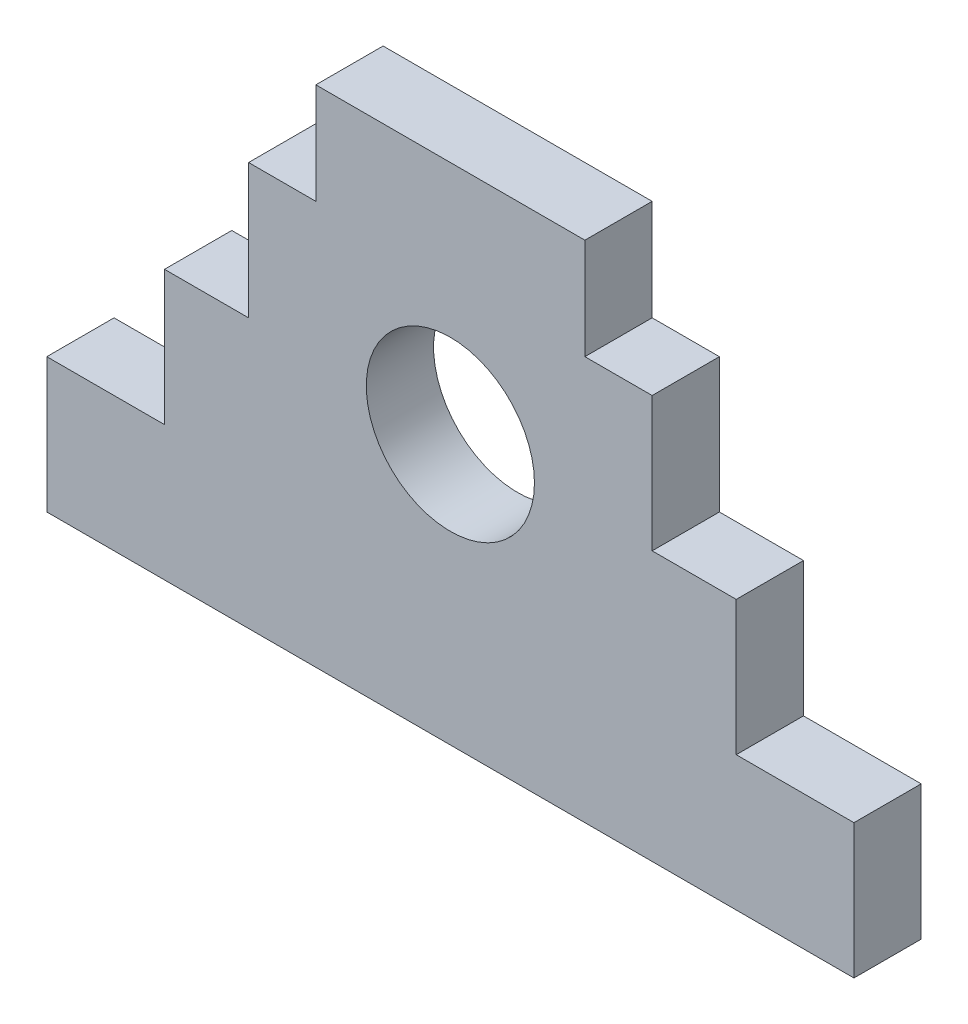
ISO-10303-21;
HEADER;
FILE_DESCRIPTION(('STEP AP214'),'2;1');
FILE_NAME('part.step','',(''),(''),'','','');
FILE_SCHEMA(('AUTOMOTIVE_DESIGN { 1 0 10303 214 1 1 1 1 }'));
ENDSEC;
DATA;
#1=APPLICATION_CONTEXT('core data for automotive mechanical design processes');
#2=APPLICATION_PROTOCOL_DEFINITION('international standard','automotive_design',2000,#1);
#3=PRODUCT_CONTEXT('',#1,'mechanical');
#4=PRODUCT('Part','Part','',(#3));
#5=PRODUCT_RELATED_PRODUCT_CATEGORY('part','',(#4));
#6=PRODUCT_DEFINITION_FORMATION('','',#4);
#7=PRODUCT_DEFINITION_CONTEXT('part definition',#1,'design');
#8=PRODUCT_DEFINITION('design','',#6,#7);
#9=PRODUCT_DEFINITION_SHAPE('','',#8);
#10=(LENGTH_UNIT() NAMED_UNIT(*) SI_UNIT(.MILLI.,.METRE.));
#11=(NAMED_UNIT(*) PLANE_ANGLE_UNIT() SI_UNIT($,.RADIAN.));
#12=(NAMED_UNIT(*) SI_UNIT($,.STERADIAN.) SOLID_ANGLE_UNIT());
#13=UNCERTAINTY_MEASURE_WITH_UNIT(LENGTH_MEASURE(1.E-05),#10,'distance_accuracy_value','');
#14=(GEOMETRIC_REPRESENTATION_CONTEXT(3) GLOBAL_UNCERTAINTY_ASSIGNED_CONTEXT((#13)) GLOBAL_UNIT_ASSIGNED_CONTEXT((#10,
#11,#12)) REPRESENTATION_CONTEXT('',''));
#15=CARTESIAN_POINT('',(0.,0.,0.));
#16=DIRECTION('',(0.,0.,1.));
#17=DIRECTION('',(1.,0.,0.));
#18=AXIS2_PLACEMENT_3D('',#15,#16,#17);
#19=CARTESIAN_POINT('',(0.,-12.7,6.35));
#20=DIRECTION('',(0.,0.,1.));
#21=DIRECTION('',(1.,0.,0.));
#22=AXIS2_PLACEMENT_3D('',#19,#20,#21);
#23=PLANE('',#22);
#24=DIRECTION('',(0.,-1.,0.));
#25=VECTOR('',#24,1.);
#26=CARTESIAN_POINT('',(0.,0.,6.35));
#27=LINE('',#26,#25);
#28=CARTESIAN_POINT('',(0.,0.,6.35));
#29=VERTEX_POINT('',#28);
#30=CARTESIAN_POINT('',(0.,-12.7,6.35));
#31=VERTEX_POINT('',#30);
#32=EDGE_CURVE('E204',#29,#31,#27,.T.);
#33=ORIENTED_EDGE('',*,*,#32,.T.);
#34=DIRECTION('',(1.,0.,0.));
#35=VECTOR('',#34,1.);
#36=CARTESIAN_POINT('',(0.,-12.7,6.35));
#37=LINE('',#36,#35);
#38=CARTESIAN_POINT('',(76.2,-12.7,6.35));
#39=VERTEX_POINT('',#38);
#40=EDGE_CURVE('E112',#31,#39,#37,.T.);
#41=ORIENTED_EDGE('',*,*,#40,.T.);
#42=DIRECTION('',(0.,1.,0.));
#43=VECTOR('',#42,1.);
#44=CARTESIAN_POINT('',(76.2,-12.7,6.35));
#45=LINE('',#44,#43);
#46=CARTESIAN_POINT('',(76.2,0.,6.35));
#47=VERTEX_POINT('',#46);
#48=EDGE_CURVE('E243',#39,#47,#45,.T.);
#49=ORIENTED_EDGE('',*,*,#48,.T.);
#50=DIRECTION('',(-1.,0.,0.));
#51=VECTOR('',#50,1.);
#52=CARTESIAN_POINT('',(76.2,0.,6.35));
#53=LINE('',#52,#51);
#54=CARTESIAN_POINT('',(65.0875,0.,6.35));
#55=VERTEX_POINT('',#54);
#56=EDGE_CURVE('E262',#47,#55,#53,.T.);
#57=ORIENTED_EDGE('',*,*,#56,.T.);
#58=DIRECTION('',(0.,1.,0.));
#59=VECTOR('',#58,1.);
#60=CARTESIAN_POINT('',(65.0875,0.,6.35));
#61=LINE('',#60,#59);
#62=CARTESIAN_POINT('',(65.0875,12.7,6.35));
#63=VERTEX_POINT('',#62);
#64=EDGE_CURVE('E259',#55,#63,#61,.T.);
#65=ORIENTED_EDGE('',*,*,#64,.T.);
#66=DIRECTION('',(-1.,0.,0.));
#67=VECTOR('',#66,1.);
#68=CARTESIAN_POINT('',(65.0875,12.7,6.35));
#69=LINE('',#68,#67);
#70=CARTESIAN_POINT('',(57.15,12.7,6.35));
#71=VERTEX_POINT('',#70);
#72=EDGE_CURVE('E261',#63,#71,#69,.T.);
#73=ORIENTED_EDGE('',*,*,#72,.T.);
#74=DIRECTION('',(0.,1.,0.));
#75=VECTOR('',#74,1.);
#76=CARTESIAN_POINT('',(57.15,12.7,6.35));
#77=LINE('',#76,#75);
#78=CARTESIAN_POINT('',(57.15,25.4,6.35));
#79=VERTEX_POINT('',#78);
#80=EDGE_CURVE('E264',#71,#79,#77,.T.);
#81=ORIENTED_EDGE('',*,*,#80,.T.);
#82=DIRECTION('',(-1.,0.,0.));
#83=VECTOR('',#82,1.);
#84=CARTESIAN_POINT('',(57.15,25.4,6.35));
#85=LINE('',#84,#83);
#86=CARTESIAN_POINT('',(50.8,25.4,6.35));
#87=VERTEX_POINT('',#86);
#88=EDGE_CURVE('E270',#79,#87,#85,.T.);
#89=ORIENTED_EDGE('',*,*,#88,.T.);
#90=DIRECTION('',(0.,1.,0.));
#91=VECTOR('',#90,1.);
#92=CARTESIAN_POINT('',(50.8,25.4,6.35));
#93=LINE('',#92,#91);
#94=CARTESIAN_POINT('',(50.8,34.925,6.35));
#95=VERTEX_POINT('',#94);
#96=EDGE_CURVE('E272',#87,#95,#93,.T.);
#97=ORIENTED_EDGE('',*,*,#96,.T.);
#98=DIRECTION('',(-1.,0.,0.));
#99=VECTOR('',#98,1.);
#100=CARTESIAN_POINT('',(25.4,34.925,6.35));
#101=LINE('',#100,#99);
#102=CARTESIAN_POINT('',(25.4,34.925,6.35));
#103=VERTEX_POINT('',#102);
#104=EDGE_CURVE('E274',#95,#103,#101,.T.);
#105=ORIENTED_EDGE('',*,*,#104,.T.);
#106=DIRECTION('',(0.,-1.,0.));
#107=VECTOR('',#106,1.);
#108=CARTESIAN_POINT('',(25.4,25.4,6.35));
#109=LINE('',#108,#107);
#110=CARTESIAN_POINT('',(25.4,25.4,6.35));
#111=VERTEX_POINT('',#110);
#112=EDGE_CURVE('E276',#103,#111,#109,.T.);
#113=ORIENTED_EDGE('',*,*,#112,.T.);
#114=DIRECTION('',(-1.,0.,0.));
#115=VECTOR('',#114,1.);
#116=CARTESIAN_POINT('',(19.05,25.4,6.35));
#117=LINE('',#116,#115);
#118=CARTESIAN_POINT('',(19.05,25.4,6.35));
#119=VERTEX_POINT('',#118);
#120=EDGE_CURVE('E278',#111,#119,#117,.T.);
#121=ORIENTED_EDGE('',*,*,#120,.T.);
#122=DIRECTION('',(0.,-1.,0.));
#123=VECTOR('',#122,1.);
#124=CARTESIAN_POINT('',(19.05,12.7,6.35));
#125=LINE('',#124,#123);
#126=CARTESIAN_POINT('',(19.05,12.7,6.35));
#127=VERTEX_POINT('',#126);
#128=EDGE_CURVE('E155',#119,#127,#125,.T.);
#129=ORIENTED_EDGE('',*,*,#128,.T.);
#130=DIRECTION('',(-1.,0.,0.));
#131=VECTOR('',#130,1.);
#132=CARTESIAN_POINT('',(11.1125,12.7,6.35));
#133=LINE('',#132,#131);
#134=CARTESIAN_POINT('',(11.1125,12.7,6.35));
#135=VERTEX_POINT('',#134);
#136=EDGE_CURVE('E149',#127,#135,#133,.T.);
#137=ORIENTED_EDGE('',*,*,#136,.T.);
#138=DIRECTION('',(0.,-1.,0.));
#139=VECTOR('',#138,1.);
#140=CARTESIAN_POINT('',(11.1125,0.,6.35));
#141=LINE('',#140,#139);
#142=CARTESIAN_POINT('',(11.1125,0.,6.35));
#143=VERTEX_POINT('',#142);
#144=EDGE_CURVE('E153',#135,#143,#141,.T.);
#145=ORIENTED_EDGE('',*,*,#144,.T.);
#146=DIRECTION('',(-1.,0.,0.));
#147=VECTOR('',#146,1.);
#148=CARTESIAN_POINT('',(0.,0.,6.35));
#149=LINE('',#148,#147);
#150=EDGE_CURVE('E45',#143,#29,#149,.T.);
#151=ORIENTED_EDGE('',*,*,#150,.T.);
#152=EDGE_LOOP('',(#33,#41,#49,#57,#65,#73,#81,#89,#97,#105,#113,#121,#129,#137,#145,#151));
#153=FACE_BOUND('',#152,.T.);
#154=CARTESIAN_POINT('',(38.1,12.7,6.35));
#155=DIRECTION('',(0.,0.,1.));
#156=DIRECTION('',(1.,0.,0.));
#157=AXIS2_PLACEMENT_3D('',#154,#155,#156);
#158=CIRCLE('',#157,7.9375);
#159=CARTESIAN_POINT('',(46.0375,12.7,6.35));
#160=VERTEX_POINT('',#159);
#161=EDGE_CURVE('E177',#160,#160,#158,.T.);
#162=ORIENTED_EDGE('',*,*,#161,.F.);
#163=EDGE_LOOP('',(#162));
#164=FACE_BOUND('',#163,.T.);
#165=ADVANCED_FACE('F28',(#153,#164),#23,.T.);
#166=CARTESIAN_POINT('',(0.,-12.7,0.));
#167=DIRECTION('',(0.,0.,1.));
#168=DIRECTION('',(1.,0.,0.));
#169=AXIS2_PLACEMENT_3D('',#166,#167,#168);
#170=PLANE('',#169);
#171=DIRECTION('',(0.,-1.,0.));
#172=VECTOR('',#171,1.);
#173=CARTESIAN_POINT('',(0.,0.,0.));
#174=LINE('',#173,#172);
#175=CARTESIAN_POINT('',(0.,0.,0.));
#176=VERTEX_POINT('',#175);
#177=CARTESIAN_POINT('',(0.,-12.7,0.));
#178=VERTEX_POINT('',#177);
#179=EDGE_CURVE('E173',#176,#178,#174,.T.);
#180=ORIENTED_EDGE('',*,*,#179,.F.);
#181=DIRECTION('',(-1.,0.,0.));
#182=VECTOR('',#181,1.);
#183=CARTESIAN_POINT('',(0.,0.,0.));
#184=LINE('',#183,#182);
#185=CARTESIAN_POINT('',(11.1125,0.,0.));
#186=VERTEX_POINT('',#185);
#187=EDGE_CURVE('E104',#186,#176,#184,.T.);
#188=ORIENTED_EDGE('',*,*,#187,.F.);
#189=DIRECTION('',(0.,-1.,0.));
#190=VECTOR('',#189,1.);
#191=CARTESIAN_POINT('',(11.1125,0.,0.));
#192=LINE('',#191,#190);
#193=CARTESIAN_POINT('',(11.1125,12.7,0.));
#194=VERTEX_POINT('',#193);
#195=EDGE_CURVE('E98',#194,#186,#192,.T.);
#196=ORIENTED_EDGE('',*,*,#195,.F.);
#197=DIRECTION('',(-1.,0.,0.));
#198=VECTOR('',#197,1.);
#199=CARTESIAN_POINT('',(11.1125,12.7,0.));
#200=LINE('',#199,#198);
#201=CARTESIAN_POINT('',(19.05,12.7,0.));
#202=VERTEX_POINT('',#201);
#203=EDGE_CURVE('E163',#202,#194,#200,.T.);
#204=ORIENTED_EDGE('',*,*,#203,.F.);
#205=DIRECTION('',(0.,-1.,0.));
#206=VECTOR('',#205,1.);
#207=CARTESIAN_POINT('',(19.05,12.7,0.));
#208=LINE('',#207,#206);
#209=CARTESIAN_POINT('',(19.05,25.4,0.));
#210=VERTEX_POINT('',#209);
#211=EDGE_CURVE('E199',#210,#202,#208,.T.);
#212=ORIENTED_EDGE('',*,*,#211,.F.);
#213=DIRECTION('',(-1.,0.,0.));
#214=VECTOR('',#213,1.);
#215=CARTESIAN_POINT('',(19.05,25.4,0.));
#216=LINE('',#215,#214);
#217=CARTESIAN_POINT('',(25.4,25.4,0.));
#218=VERTEX_POINT('',#217);
#219=EDGE_CURVE('E197',#218,#210,#216,.T.);
#220=ORIENTED_EDGE('',*,*,#219,.F.);
#221=DIRECTION('',(0.,-1.,0.));
#222=VECTOR('',#221,1.);
#223=CARTESIAN_POINT('',(25.4,25.4,0.));
#224=LINE('',#223,#222);
#225=CARTESIAN_POINT('',(25.4,34.925,0.));
#226=VERTEX_POINT('',#225);
#227=EDGE_CURVE('E195',#226,#218,#224,.T.);
#228=ORIENTED_EDGE('',*,*,#227,.F.);
#229=DIRECTION('',(-1.,0.,0.));
#230=VECTOR('',#229,1.);
#231=CARTESIAN_POINT('',(25.4,34.925,0.));
#232=LINE('',#231,#230);
#233=CARTESIAN_POINT('',(50.8,34.925,0.));
#234=VERTEX_POINT('',#233);
#235=EDGE_CURVE('E193',#234,#226,#232,.T.);
#236=ORIENTED_EDGE('',*,*,#235,.F.);
#237=DIRECTION('',(0.,1.,0.));
#238=VECTOR('',#237,1.);
#239=CARTESIAN_POINT('',(50.8,25.4,0.));
#240=LINE('',#239,#238);
#241=CARTESIAN_POINT('',(50.8,25.4,0.));
#242=VERTEX_POINT('',#241);
#243=EDGE_CURVE('E191',#242,#234,#240,.T.);
#244=ORIENTED_EDGE('',*,*,#243,.F.);
#245=DIRECTION('',(-1.,0.,0.));
#246=VECTOR('',#245,1.);
#247=CARTESIAN_POINT('',(57.15,25.4,0.));
#248=LINE('',#247,#246);
#249=CARTESIAN_POINT('',(57.15,25.4,0.));
#250=VERTEX_POINT('',#249);
#251=EDGE_CURVE('E189',#250,#242,#248,.T.);
#252=ORIENTED_EDGE('',*,*,#251,.F.);
#253=DIRECTION('',(0.,1.,0.));
#254=VECTOR('',#253,1.);
#255=CARTESIAN_POINT('',(57.15,12.7,0.));
#256=LINE('',#255,#254);
#257=CARTESIAN_POINT('',(57.15,12.7,0.));
#258=VERTEX_POINT('',#257);
#259=EDGE_CURVE('E187',#258,#250,#256,.T.);
#260=ORIENTED_EDGE('',*,*,#259,.F.);
#261=DIRECTION('',(-1.,0.,0.));
#262=VECTOR('',#261,1.);
#263=CARTESIAN_POINT('',(65.0875,12.7,0.));
#264=LINE('',#263,#262);
#265=CARTESIAN_POINT('',(65.0875,12.7,0.));
#266=VERTEX_POINT('',#265);
#267=EDGE_CURVE('E185',#266,#258,#264,.T.);
#268=ORIENTED_EDGE('',*,*,#267,.F.);
#269=DIRECTION('',(0.,1.,0.));
#270=VECTOR('',#269,1.);
#271=CARTESIAN_POINT('',(65.0875,0.,0.));
#272=LINE('',#271,#270);
#273=CARTESIAN_POINT('',(65.0875,0.,0.));
#274=VERTEX_POINT('',#273);
#275=EDGE_CURVE('E183',#274,#266,#272,.T.);
#276=ORIENTED_EDGE('',*,*,#275,.F.);
#277=DIRECTION('',(-1.,0.,0.));
#278=VECTOR('',#277,1.);
#279=CARTESIAN_POINT('',(76.2,0.,0.));
#280=LINE('',#279,#278);
#281=CARTESIAN_POINT('',(76.2,0.,0.));
#282=VERTEX_POINT('',#281);
#283=EDGE_CURVE('E181',#282,#274,#280,.T.);
#284=ORIENTED_EDGE('',*,*,#283,.F.);
#285=DIRECTION('',(0.,1.,0.));
#286=VECTOR('',#285,1.);
#287=CARTESIAN_POINT('',(76.2,-12.7,0.));
#288=LINE('',#287,#286);
#289=CARTESIAN_POINT('',(76.2,-12.7,0.));
#290=VERTEX_POINT('',#289);
#291=EDGE_CURVE('E179',#290,#282,#288,.T.);
#292=ORIENTED_EDGE('',*,*,#291,.F.);
#293=DIRECTION('',(1.,0.,0.));
#294=VECTOR('',#293,1.);
#295=CARTESIAN_POINT('',(0.,-12.7,0.));
#296=LINE('',#295,#294);
#297=EDGE_CURVE('E176',#178,#290,#296,.T.);
#298=ORIENTED_EDGE('',*,*,#297,.F.);
#299=EDGE_LOOP('',(#180,#188,#196,#204,#212,#220,#228,#236,#244,#252,#260,#268,#276,#284,#292,#298));
#300=FACE_BOUND('',#299,.T.);
#301=CARTESIAN_POINT('',(38.1,12.7,0.));
#302=DIRECTION('',(0.,0.,1.));
#303=DIRECTION('',(1.,0.,0.));
#304=AXIS2_PLACEMENT_3D('',#301,#302,#303);
#305=CIRCLE('',#304,7.9375);
#306=CARTESIAN_POINT('',(46.0375,12.7,0.));
#307=VERTEX_POINT('',#306);
#308=EDGE_CURVE('E477',#307,#307,#305,.T.);
#309=ORIENTED_EDGE('',*,*,#308,.T.);
#310=EDGE_LOOP('',(#309));
#311=FACE_BOUND('',#310,.T.);
#312=ADVANCED_FACE('F247',(#300,#311),#170,.F.);
#313=CARTESIAN_POINT('',(0.,0.,6.35));
#314=DIRECTION('',(1.,0.,0.));
#315=DIRECTION('',(0.,1.,0.));
#316=AXIS2_PLACEMENT_3D('',#313,#314,#315);
#317=PLANE('',#316);
#318=ORIENTED_EDGE('',*,*,#179,.T.);
#319=DIRECTION('',(0.,0.,-1.));
#320=VECTOR('',#319,1.);
#321=CARTESIAN_POINT('',(0.,-12.7,6.35));
#322=LINE('',#321,#320);
#323=EDGE_CURVE('E11',#31,#178,#322,.T.);
#324=ORIENTED_EDGE('',*,*,#323,.F.);
#325=ORIENTED_EDGE('',*,*,#32,.F.);
#326=DIRECTION('',(0.,0.,-1.));
#327=VECTOR('',#326,1.);
#328=CARTESIAN_POINT('',(0.,0.,6.35));
#329=LINE('',#328,#327);
#330=EDGE_CURVE('E169',#29,#176,#329,.T.);
#331=ORIENTED_EDGE('',*,*,#330,.T.);
#332=EDGE_LOOP('',(#318,#324,#325,#331));
#333=FACE_BOUND('',#332,.T.);
#334=ADVANCED_FACE('F30',(#333),#317,.F.);
#335=CARTESIAN_POINT('',(0.,-12.7,6.35));
#336=DIRECTION('',(0.,1.,0.));
#337=DIRECTION('',(-1.,0.,0.));
#338=AXIS2_PLACEMENT_3D('',#335,#336,#337);
#339=PLANE('',#338);
#340=ORIENTED_EDGE('',*,*,#297,.T.);
#341=DIRECTION('',(0.,0.,-1.));
#342=VECTOR('',#341,1.);
#343=CARTESIAN_POINT('',(76.2,-12.7,6.35));
#344=LINE('',#343,#342);
#345=EDGE_CURVE('E37',#39,#290,#344,.T.);
#346=ORIENTED_EDGE('',*,*,#345,.F.);
#347=ORIENTED_EDGE('',*,*,#40,.F.);
#348=ORIENTED_EDGE('',*,*,#323,.T.);
#349=EDGE_LOOP('',(#340,#346,#347,#348));
#350=FACE_BOUND('',#349,.T.);
#351=ADVANCED_FACE('F312',(#350),#339,.F.);
#352=CARTESIAN_POINT('',(76.2,-12.7,6.35));
#353=DIRECTION('',(-1.,0.,0.));
#354=DIRECTION('',(0.,0.,1.));
#355=AXIS2_PLACEMENT_3D('',#352,#353,#354);
#356=PLANE('',#355);
#357=ORIENTED_EDGE('',*,*,#291,.T.);
#358=DIRECTION('',(0.,0.,-1.));
#359=VECTOR('',#358,1.);
#360=CARTESIAN_POINT('',(76.2,0.,6.35));
#361=LINE('',#360,#359);
#362=EDGE_CURVE('E235',#47,#282,#361,.T.);
#363=ORIENTED_EDGE('',*,*,#362,.F.);
#364=ORIENTED_EDGE('',*,*,#48,.F.);
#365=ORIENTED_EDGE('',*,*,#345,.T.);
#366=EDGE_LOOP('',(#357,#363,#364,#365));
#367=FACE_BOUND('',#366,.T.);
#368=ADVANCED_FACE('F241',(#367),#356,.F.);
#369=CARTESIAN_POINT('',(76.2,0.,6.35));
#370=DIRECTION('',(0.,-1.,0.));
#371=DIRECTION('',(1.,0.,0.));
#372=AXIS2_PLACEMENT_3D('',#369,#370,#371);
#373=PLANE('',#372);
#374=ORIENTED_EDGE('',*,*,#283,.T.);
#375=DIRECTION('',(0.,0.,-1.));
#376=VECTOR('',#375,1.);
#377=CARTESIAN_POINT('',(65.0875,0.,6.35));
#378=LINE('',#377,#376);
#379=EDGE_CURVE('E232',#55,#274,#378,.T.);
#380=ORIENTED_EDGE('',*,*,#379,.F.);
#381=ORIENTED_EDGE('',*,*,#56,.F.);
#382=ORIENTED_EDGE('',*,*,#362,.T.);
#383=EDGE_LOOP('',(#374,#380,#381,#382));
#384=FACE_BOUND('',#383,.T.);
#385=ADVANCED_FACE('F253',(#384),#373,.F.);
#386=CARTESIAN_POINT('',(65.0875,0.,6.35));
#387=DIRECTION('',(-1.,0.,0.));
#388=DIRECTION('',(0.,0.,1.));
#389=AXIS2_PLACEMENT_3D('',#386,#387,#388);
#390=PLANE('',#389);
#391=ORIENTED_EDGE('',*,*,#275,.T.);
#392=DIRECTION('',(0.,0.,-1.));
#393=VECTOR('',#392,1.);
#394=CARTESIAN_POINT('',(65.0875,12.7,6.35));
#395=LINE('',#394,#393);
#396=EDGE_CURVE('E229',#63,#266,#395,.T.);
#397=ORIENTED_EDGE('',*,*,#396,.F.);
#398=ORIENTED_EDGE('',*,*,#64,.F.);
#399=ORIENTED_EDGE('',*,*,#379,.T.);
#400=EDGE_LOOP('',(#391,#397,#398,#399));
#401=FACE_BOUND('',#400,.T.);
#402=ADVANCED_FACE('F257',(#401),#390,.F.);
#403=CARTESIAN_POINT('',(65.0875,12.7,6.35));
#404=DIRECTION('',(0.,-1.,0.));
#405=DIRECTION('',(1.,0.,0.));
#406=AXIS2_PLACEMENT_3D('',#403,#404,#405);
#407=PLANE('',#406);
#408=ORIENTED_EDGE('',*,*,#267,.T.);
#409=DIRECTION('',(0.,0.,-1.));
#410=VECTOR('',#409,1.);
#411=CARTESIAN_POINT('',(57.15,12.7,6.35));
#412=LINE('',#411,#410);
#413=EDGE_CURVE('E226',#71,#258,#412,.T.);
#414=ORIENTED_EDGE('',*,*,#413,.F.);
#415=ORIENTED_EDGE('',*,*,#72,.F.);
#416=ORIENTED_EDGE('',*,*,#396,.T.);
#417=EDGE_LOOP('',(#408,#414,#415,#416));
#418=FACE_BOUND('',#417,.T.);
#419=ADVANCED_FACE('F325',(#418),#407,.F.);
#420=CARTESIAN_POINT('',(57.15,12.7,6.35));
#421=DIRECTION('',(-1.,0.,0.));
#422=DIRECTION('',(0.,0.,1.));
#423=AXIS2_PLACEMENT_3D('',#420,#421,#422);
#424=PLANE('',#423);
#425=ORIENTED_EDGE('',*,*,#259,.T.);
#426=DIRECTION('',(0.,0.,-1.));
#427=VECTOR('',#426,1.);
#428=CARTESIAN_POINT('',(57.15,25.4,6.35));
#429=LINE('',#428,#427);
#430=EDGE_CURVE('E223',#79,#250,#429,.T.);
#431=ORIENTED_EDGE('',*,*,#430,.F.);
#432=ORIENTED_EDGE('',*,*,#80,.F.);
#433=ORIENTED_EDGE('',*,*,#413,.T.);
#434=EDGE_LOOP('',(#425,#431,#432,#433));
#435=FACE_BOUND('',#434,.T.);
#436=ADVANCED_FACE('F328',(#435),#424,.F.);
#437=CARTESIAN_POINT('',(57.15,25.4,6.35));
#438=DIRECTION('',(0.,-1.,0.));
#439=DIRECTION('',(0.,0.,-1.));
#440=AXIS2_PLACEMENT_3D('',#437,#438,#439);
#441=PLANE('',#440);
#442=ORIENTED_EDGE('',*,*,#251,.T.);
#443=DIRECTION('',(0.,0.,-1.));
#444=VECTOR('',#443,1.);
#445=CARTESIAN_POINT('',(50.8,25.4,6.35));
#446=LINE('',#445,#444);
#447=EDGE_CURVE('E220',#87,#242,#446,.T.);
#448=ORIENTED_EDGE('',*,*,#447,.F.);
#449=ORIENTED_EDGE('',*,*,#88,.F.);
#450=ORIENTED_EDGE('',*,*,#430,.T.);
#451=EDGE_LOOP('',(#442,#448,#449,#450));
#452=FACE_BOUND('',#451,.T.);
#453=ADVANCED_FACE('F332',(#452),#441,.F.);
#454=CARTESIAN_POINT('',(50.8,25.4,6.35));
#455=DIRECTION('',(-1.,0.,0.));
#456=DIRECTION('',(0.,0.,1.));
#457=AXIS2_PLACEMENT_3D('',#454,#455,#456);
#458=PLANE('',#457);
#459=ORIENTED_EDGE('',*,*,#243,.T.);
#460=DIRECTION('',(0.,0.,-1.));
#461=VECTOR('',#460,1.);
#462=CARTESIAN_POINT('',(50.8,34.925,6.35));
#463=LINE('',#462,#461);
#464=EDGE_CURVE('E217',#95,#234,#463,.T.);
#465=ORIENTED_EDGE('',*,*,#464,.F.);
#466=ORIENTED_EDGE('',*,*,#96,.F.);
#467=ORIENTED_EDGE('',*,*,#447,.T.);
#468=EDGE_LOOP('',(#459,#465,#466,#467));
#469=FACE_BOUND('',#468,.T.);
#470=ADVANCED_FACE('F336',(#469),#458,.F.);
#471=CARTESIAN_POINT('',(25.4,34.925,6.35));
#472=DIRECTION('',(0.,-1.,0.));
#473=DIRECTION('',(0.,0.,-1.));
#474=AXIS2_PLACEMENT_3D('',#471,#472,#473);
#475=PLANE('',#474);
#476=ORIENTED_EDGE('',*,*,#235,.T.);
#477=DIRECTION('',(0.,0.,-1.));
#478=VECTOR('',#477,1.);
#479=CARTESIAN_POINT('',(25.4,34.925,6.35));
#480=LINE('',#479,#478);
#481=EDGE_CURVE('E214',#103,#226,#480,.T.);
#482=ORIENTED_EDGE('',*,*,#481,.F.);
#483=ORIENTED_EDGE('',*,*,#104,.F.);
#484=ORIENTED_EDGE('',*,*,#464,.T.);
#485=EDGE_LOOP('',(#476,#482,#483,#484));
#486=FACE_BOUND('',#485,.T.);
#487=ADVANCED_FACE('F340',(#486),#475,.F.);
#488=CARTESIAN_POINT('',(25.4,25.4,6.35));
#489=DIRECTION('',(1.,0.,0.));
#490=DIRECTION('',(0.,1.,0.));
#491=AXIS2_PLACEMENT_3D('',#488,#489,#490);
#492=PLANE('',#491);
#493=ORIENTED_EDGE('',*,*,#227,.T.);
#494=DIRECTION('',(0.,0.,-1.));
#495=VECTOR('',#494,1.);
#496=CARTESIAN_POINT('',(25.4,25.4,6.35));
#497=LINE('',#496,#495);
#498=EDGE_CURVE('E211',#111,#218,#497,.T.);
#499=ORIENTED_EDGE('',*,*,#498,.F.);
#500=ORIENTED_EDGE('',*,*,#112,.F.);
#501=ORIENTED_EDGE('',*,*,#481,.T.);
#502=EDGE_LOOP('',(#493,#499,#500,#501));
#503=FACE_BOUND('',#502,.T.);
#504=ADVANCED_FACE('F344',(#503),#492,.F.);
#505=CARTESIAN_POINT('',(19.05,25.4,6.35));
#506=DIRECTION('',(0.,-1.,0.));
#507=DIRECTION('',(0.,0.,-1.));
#508=AXIS2_PLACEMENT_3D('',#505,#506,#507);
#509=PLANE('',#508);
#510=ORIENTED_EDGE('',*,*,#219,.T.);
#511=DIRECTION('',(0.,0.,-1.));
#512=VECTOR('',#511,1.);
#513=CARTESIAN_POINT('',(19.05,25.4,6.35));
#514=LINE('',#513,#512);
#515=EDGE_CURVE('E208',#119,#210,#514,.T.);
#516=ORIENTED_EDGE('',*,*,#515,.F.);
#517=ORIENTED_EDGE('',*,*,#120,.F.);
#518=ORIENTED_EDGE('',*,*,#498,.T.);
#519=EDGE_LOOP('',(#510,#516,#517,#518));
#520=FACE_BOUND('',#519,.T.);
#521=ADVANCED_FACE('F284',(#520),#509,.F.);
#522=CARTESIAN_POINT('',(19.05,12.7,6.35));
#523=DIRECTION('',(1.,0.,0.));
#524=DIRECTION('',(0.,0.,-1.));
#525=AXIS2_PLACEMENT_3D('',#522,#523,#524);
#526=PLANE('',#525);
#527=ORIENTED_EDGE('',*,*,#211,.T.);
#528=DIRECTION('',(0.,0.,-1.));
#529=VECTOR('',#528,1.);
#530=CARTESIAN_POINT('',(19.05,12.7,6.35));
#531=LINE('',#530,#529);
#532=EDGE_CURVE('E164',#127,#202,#531,.T.);
#533=ORIENTED_EDGE('',*,*,#532,.F.);
#534=ORIENTED_EDGE('',*,*,#128,.F.);
#535=ORIENTED_EDGE('',*,*,#515,.T.);
#536=EDGE_LOOP('',(#527,#533,#534,#535));
#537=FACE_BOUND('',#536,.T.);
#538=ADVANCED_FACE('F288',(#537),#526,.F.);
#539=CARTESIAN_POINT('',(11.1125,12.7,6.35));
#540=DIRECTION('',(0.,-1.,0.));
#541=DIRECTION('',(0.,0.,-1.));
#542=AXIS2_PLACEMENT_3D('',#539,#540,#541);
#543=PLANE('',#542);
#544=ORIENTED_EDGE('',*,*,#203,.T.);
#545=DIRECTION('',(0.,0.,-1.));
#546=VECTOR('',#545,1.);
#547=CARTESIAN_POINT('',(11.1125,12.7,6.35));
#548=LINE('',#547,#546);
#549=EDGE_CURVE('E160',#135,#194,#548,.T.);
#550=ORIENTED_EDGE('',*,*,#549,.F.);
#551=ORIENTED_EDGE('',*,*,#136,.F.);
#552=ORIENTED_EDGE('',*,*,#532,.T.);
#553=EDGE_LOOP('',(#544,#550,#551,#552));
#554=FACE_BOUND('',#553,.T.);
#555=ADVANCED_FACE('F161',(#554),#543,.F.);
#556=CARTESIAN_POINT('',(11.1125,0.,6.35));
#557=DIRECTION('',(1.,0.,0.));
#558=DIRECTION('',(0.,0.,-1.));
#559=AXIS2_PLACEMENT_3D('',#556,#557,#558);
#560=PLANE('',#559);
#561=ORIENTED_EDGE('',*,*,#195,.T.);
#562=DIRECTION('',(0.,0.,-1.));
#563=VECTOR('',#562,1.);
#564=CARTESIAN_POINT('',(11.1125,0.,6.35));
#565=LINE('',#564,#563);
#566=EDGE_CURVE('E165',#143,#186,#565,.T.);
#567=ORIENTED_EDGE('',*,*,#566,.F.);
#568=ORIENTED_EDGE('',*,*,#144,.F.);
#569=ORIENTED_EDGE('',*,*,#549,.T.);
#570=EDGE_LOOP('',(#561,#567,#568,#569));
#571=FACE_BOUND('',#570,.T.);
#572=ADVANCED_FACE('F167',(#571),#560,.F.);
#573=CARTESIAN_POINT('',(0.,0.,6.35));
#574=DIRECTION('',(0.,-1.,0.));
#575=DIRECTION('',(0.,0.,-1.));
#576=AXIS2_PLACEMENT_3D('',#573,#574,#575);
#577=PLANE('',#576);
#578=ORIENTED_EDGE('',*,*,#187,.T.);
#579=ORIENTED_EDGE('',*,*,#330,.F.);
#580=ORIENTED_EDGE('',*,*,#150,.F.);
#581=ORIENTED_EDGE('',*,*,#566,.T.);
#582=EDGE_LOOP('',(#578,#579,#580,#581));
#583=FACE_BOUND('',#582,.T.);
#584=ADVANCED_FACE('F292',(#583),#577,.F.);
#585=CARTESIAN_POINT('',(38.1,12.7,6.35));
#586=DIRECTION('',(0.,0.,-1.));
#587=DIRECTION('',(-1.,0.,0.));
#588=AXIS2_PLACEMENT_3D('',#585,#586,#587);
#589=CYLINDRICAL_SURFACE('',#588,7.9375);
#590=ORIENTED_EDGE('',*,*,#161,.T.);
#591=EDGE_LOOP('',(#590));
#592=FACE_BOUND('',#591,.T.);
#593=ORIENTED_EDGE('',*,*,#308,.F.);
#594=EDGE_LOOP('',(#593));
#595=FACE_BOUND('',#594,.T.);
#596=ADVANCED_FACE('F294',(#592,#595),#589,.F.);
#597=CLOSED_SHELL('',(#165,#312,#334,#351,#368,#385,#402,#419,#436,#453,#470,#487,#504,#521,
#538,#555,#572,#584,#596));
#598=MANIFOLD_SOLID_BREP('B2',#597);
#599=ADVANCED_BREP_SHAPE_REPRESENTATION('',(#18,#598),#14);
#600=SHAPE_DEFINITION_REPRESENTATION(#9,#599);
ENDSEC;
END-ISO-10303-21;
